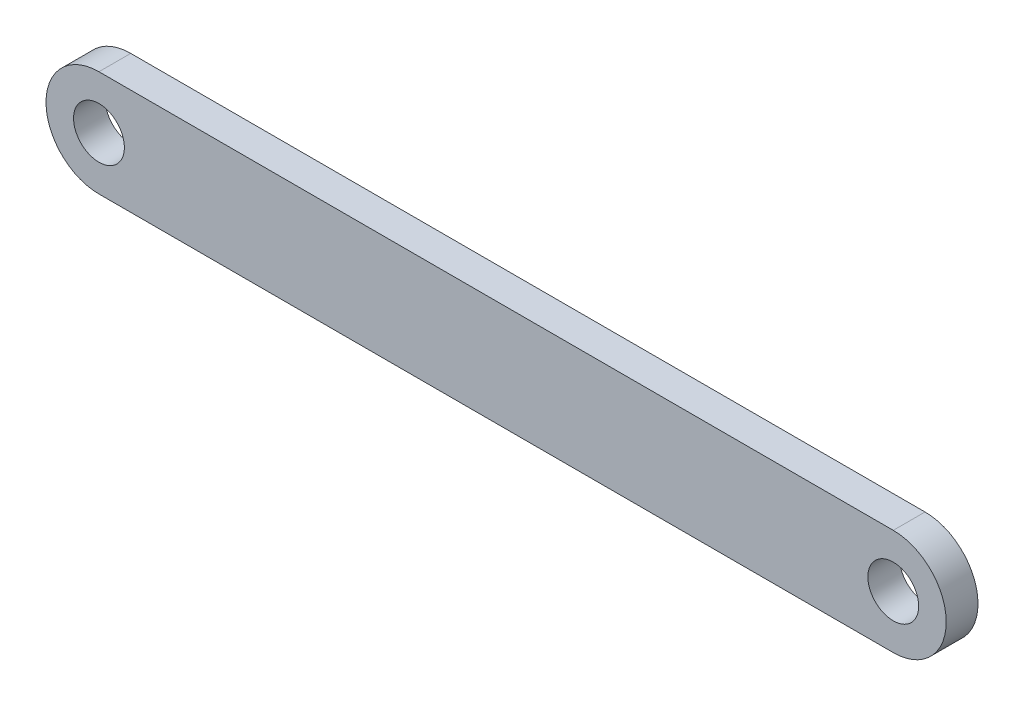
ISO-10303-21;
HEADER;
FILE_DESCRIPTION(('STEP AP214'),'2;1');
FILE_NAME('part.step','',(''),(''),'','','');
FILE_SCHEMA(('AUTOMOTIVE_DESIGN { 1 0 10303 214 1 1 1 1 }'));
ENDSEC;
DATA;
#1=APPLICATION_CONTEXT('core data for automotive mechanical design processes');
#2=APPLICATION_PROTOCOL_DEFINITION('international standard','automotive_design',2000,#1);
#3=PRODUCT_CONTEXT('',#1,'mechanical');
#4=PRODUCT('Part','Part','',(#3));
#5=PRODUCT_RELATED_PRODUCT_CATEGORY('part','',(#4));
#6=PRODUCT_DEFINITION_FORMATION('','',#4);
#7=PRODUCT_DEFINITION_CONTEXT('part definition',#1,'design');
#8=PRODUCT_DEFINITION('design','',#6,#7);
#9=PRODUCT_DEFINITION_SHAPE('','',#8);
#10=(LENGTH_UNIT() NAMED_UNIT(*) SI_UNIT(.MILLI.,.METRE.));
#11=(NAMED_UNIT(*) PLANE_ANGLE_UNIT() SI_UNIT($,.RADIAN.));
#12=(NAMED_UNIT(*) SI_UNIT($,.STERADIAN.) SOLID_ANGLE_UNIT());
#13=UNCERTAINTY_MEASURE_WITH_UNIT(LENGTH_MEASURE(1.E-05),#10,'distance_accuracy_value','');
#14=(GEOMETRIC_REPRESENTATION_CONTEXT(3) GLOBAL_UNCERTAINTY_ASSIGNED_CONTEXT((#13)) GLOBAL_UNIT_ASSIGNED_CONTEXT((#10,
#11,#12)) REPRESENTATION_CONTEXT('',''));
#15=CARTESIAN_POINT('',(0.,0.,0.));
#16=DIRECTION('',(0.,0.,1.));
#17=DIRECTION('',(1.,0.,0.));
#18=AXIS2_PLACEMENT_3D('',#15,#16,#17);
#19=CARTESIAN_POINT('',(120.078651701107,195.032322866027,3.));
#20=DIRECTION('',(0.,0.,1.));
#21=DIRECTION('',(1.,0.,0.));
#22=AXIS2_PLACEMENT_3D('',#19,#20,#21);
#23=PLANE('',#22);
#24=CARTESIAN_POINT('',(120.078651701107,195.032322866027,3.));
#25=DIRECTION('',(0.,0.,1.));
#26=DIRECTION('',(1.,0.,0.));
#27=AXIS2_PLACEMENT_3D('',#24,#25,#26);
#28=CIRCLE('',#27,2.4);
#29=CARTESIAN_POINT('',(122.478651701107,195.032322866027,3.));
#30=VERTEX_POINT('',#29);
#31=EDGE_CURVE('E106',#30,#30,#28,.T.);
#32=ORIENTED_EDGE('',*,*,#31,.F.);
#33=EDGE_LOOP('',(#32));
#34=FACE_BOUND('',#33,.T.);
#35=CARTESIAN_POINT('',(120.078651701107,195.032322866027,3.));
#36=DIRECTION('',(0.,0.,1.));
#37=DIRECTION('',(1.,0.,0.));
#38=AXIS2_PLACEMENT_3D('',#35,#36,#37);
#39=CIRCLE('',#38,4.99999999999999);
#40=CARTESIAN_POINT('',(120.078651701107,200.032322866027,3.));
#41=VERTEX_POINT('',#40);
#42=CARTESIAN_POINT('',(120.078651701107,190.032322866027,3.));
#43=VERTEX_POINT('',#42);
#44=EDGE_CURVE('E91',#41,#43,#39,.T.);
#45=ORIENTED_EDGE('',*,*,#44,.T.);
#46=DIRECTION('',(1.,0.,0.));
#47=VECTOR('',#46,1.);
#48=CARTESIAN_POINT('',(120.078651701107,190.032322866027,3.));
#49=LINE('',#48,#47);
#50=CARTESIAN_POINT('',(195.078651701107,190.032322866027,3.));
#51=VERTEX_POINT('',#50);
#52=EDGE_CURVE('E86',#43,#51,#49,.T.);
#53=ORIENTED_EDGE('',*,*,#52,.T.);
#54=CARTESIAN_POINT('',(195.078651701107,195.032322866027,3.));
#55=DIRECTION('',(0.,0.,1.));
#56=DIRECTION('',(-1.,0.,0.));
#57=AXIS2_PLACEMENT_3D('',#54,#55,#56);
#58=CIRCLE('',#57,5.);
#59=CARTESIAN_POINT('',(195.078651701107,200.032322866027,3.));
#60=VERTEX_POINT('',#59);
#61=EDGE_CURVE('E89',#51,#60,#58,.T.);
#62=ORIENTED_EDGE('',*,*,#61,.T.);
#63=DIRECTION('',(-1.,0.,0.));
#64=VECTOR('',#63,1.);
#65=CARTESIAN_POINT('',(120.078651701107,200.032322866027,3.));
#66=LINE('',#65,#64);
#67=EDGE_CURVE('E56',#60,#41,#66,.T.);
#68=ORIENTED_EDGE('',*,*,#67,.T.);
#69=EDGE_LOOP('',(#45,#53,#62,#68));
#70=FACE_BOUND('',#69,.T.);
#71=CARTESIAN_POINT('',(195.078651701107,195.032322866027,3.));
#72=DIRECTION('',(0.,0.,1.));
#73=DIRECTION('',(1.,0.,0.));
#74=AXIS2_PLACEMENT_3D('',#71,#72,#73);
#75=CIRCLE('',#74,2.4);
#76=CARTESIAN_POINT('',(197.478651701107,195.032322866027,3.));
#77=VERTEX_POINT('',#76);
#78=EDGE_CURVE('E121',#77,#77,#75,.T.);
#79=ORIENTED_EDGE('',*,*,#78,.F.);
#80=EDGE_LOOP('',(#79));
#81=FACE_BOUND('',#80,.T.);
#82=ADVANCED_FACE('F39',(#34,#70,#81),#23,.T.);
#83=CARTESIAN_POINT('',(120.078651701107,195.032322866027,0.));
#84=DIRECTION('',(0.,0.,1.));
#85=DIRECTION('',(1.,0.,0.));
#86=AXIS2_PLACEMENT_3D('',#83,#84,#85);
#87=PLANE('',#86);
#88=CARTESIAN_POINT('',(120.078651701107,195.032322866027,0.));
#89=DIRECTION('',(0.,0.,1.));
#90=DIRECTION('',(1.,0.,0.));
#91=AXIS2_PLACEMENT_3D('',#88,#89,#90);
#92=CIRCLE('',#91,4.99999999999999);
#93=CARTESIAN_POINT('',(120.078651701107,200.032322866027,0.));
#94=VERTEX_POINT('',#93);
#95=CARTESIAN_POINT('',(120.078651701107,190.032322866027,0.));
#96=VERTEX_POINT('',#95);
#97=EDGE_CURVE('E103',#94,#96,#92,.T.);
#98=ORIENTED_EDGE('',*,*,#97,.F.);
#99=DIRECTION('',(-1.,0.,0.));
#100=VECTOR('',#99,1.);
#101=CARTESIAN_POINT('',(120.078651701107,200.032322866027,0.));
#102=LINE('',#101,#100);
#103=CARTESIAN_POINT('',(195.078651701107,200.032322866027,0.));
#104=VERTEX_POINT('',#103);
#105=EDGE_CURVE('E79',#104,#94,#102,.T.);
#106=ORIENTED_EDGE('',*,*,#105,.F.);
#107=CARTESIAN_POINT('',(195.078651701107,195.032322866027,0.));
#108=DIRECTION('',(0.,0.,1.));
#109=DIRECTION('',(-1.,0.,0.));
#110=AXIS2_PLACEMENT_3D('',#107,#108,#109);
#111=CIRCLE('',#110,5.);
#112=CARTESIAN_POINT('',(195.078651701107,190.032322866027,0.));
#113=VERTEX_POINT('',#112);
#114=EDGE_CURVE('E73',#113,#104,#111,.T.);
#115=ORIENTED_EDGE('',*,*,#114,.F.);
#116=DIRECTION('',(1.,0.,0.));
#117=VECTOR('',#116,1.);
#118=CARTESIAN_POINT('',(120.078651701107,190.032322866027,0.));
#119=LINE('',#118,#117);
#120=EDGE_CURVE('E95',#96,#113,#119,.T.);
#121=ORIENTED_EDGE('',*,*,#120,.F.);
#122=EDGE_LOOP('',(#98,#106,#115,#121));
#123=FACE_BOUND('',#122,.T.);
#124=CARTESIAN_POINT('',(120.078651701107,195.032322866027,0.));
#125=DIRECTION('',(0.,0.,1.));
#126=DIRECTION('',(1.,0.,0.));
#127=AXIS2_PLACEMENT_3D('',#124,#125,#126);
#128=CIRCLE('',#127,2.4);
#129=CARTESIAN_POINT('',(122.478651701107,195.032322866027,0.));
#130=VERTEX_POINT('',#129);
#131=EDGE_CURVE('E118',#130,#130,#128,.T.);
#132=ORIENTED_EDGE('',*,*,#131,.T.);
#133=EDGE_LOOP('',(#132));
#134=FACE_BOUND('',#133,.T.);
#135=CARTESIAN_POINT('',(195.078651701107,195.032322866027,0.));
#136=DIRECTION('',(0.,0.,1.));
#137=DIRECTION('',(1.,0.,0.));
#138=AXIS2_PLACEMENT_3D('',#135,#136,#137);
#139=CIRCLE('',#138,2.4);
#140=CARTESIAN_POINT('',(197.478651701107,195.032322866027,0.));
#141=VERTEX_POINT('',#140);
#142=EDGE_CURVE('E124',#141,#141,#139,.T.);
#143=ORIENTED_EDGE('',*,*,#142,.T.);
#144=EDGE_LOOP('',(#143));
#145=FACE_BOUND('',#144,.T.);
#146=ADVANCED_FACE('F114',(#123,#134,#145),#87,.F.);
#147=CARTESIAN_POINT('',(120.078651701107,195.032322866027,3.));
#148=DIRECTION('',(0.,0.,-1.));
#149=DIRECTION('',(-1.,0.,0.));
#150=AXIS2_PLACEMENT_3D('',#147,#148,#149);
#151=CYLINDRICAL_SURFACE('',#150,4.99999999999999);
#152=ORIENTED_EDGE('',*,*,#97,.T.);
#153=DIRECTION('',(0.,0.,-1.));
#154=VECTOR('',#153,1.);
#155=CARTESIAN_POINT('',(120.078651701107,190.032322866027,3.));
#156=LINE('',#155,#154);
#157=EDGE_CURVE('E11',#43,#96,#156,.T.);
#158=ORIENTED_EDGE('',*,*,#157,.F.);
#159=ORIENTED_EDGE('',*,*,#44,.F.);
#160=DIRECTION('',(0.,0.,-1.));
#161=VECTOR('',#160,1.);
#162=CARTESIAN_POINT('',(120.078651701107,200.032322866027,3.));
#163=LINE('',#162,#161);
#164=EDGE_CURVE('E99',#41,#94,#163,.T.);
#165=ORIENTED_EDGE('',*,*,#164,.T.);
#166=EDGE_LOOP('',(#152,#158,#159,#165));
#167=FACE_BOUND('',#166,.T.);
#168=ADVANCED_FACE('F41',(#167),#151,.T.);
#169=CARTESIAN_POINT('',(120.078651701107,190.032322866027,3.));
#170=DIRECTION('',(0.,1.,0.));
#171=DIRECTION('',(0.,0.,1.));
#172=AXIS2_PLACEMENT_3D('',#169,#170,#171);
#173=PLANE('',#172);
#174=ORIENTED_EDGE('',*,*,#120,.T.);
#175=DIRECTION('',(0.,0.,-1.));
#176=VECTOR('',#175,1.);
#177=CARTESIAN_POINT('',(195.078651701107,190.032322866027,3.));
#178=LINE('',#177,#176);
#179=EDGE_CURVE('E48',#51,#113,#178,.T.);
#180=ORIENTED_EDGE('',*,*,#179,.F.);
#181=ORIENTED_EDGE('',*,*,#52,.F.);
#182=ORIENTED_EDGE('',*,*,#157,.T.);
#183=EDGE_LOOP('',(#174,#180,#181,#182));
#184=FACE_BOUND('',#183,.T.);
#185=ADVANCED_FACE('F94',(#184),#173,.F.);
#186=CARTESIAN_POINT('',(195.078651701107,195.032322866027,3.));
#187=DIRECTION('',(0.,0.,-1.));
#188=DIRECTION('',(-1.,0.,0.));
#189=AXIS2_PLACEMENT_3D('',#186,#187,#188);
#190=CYLINDRICAL_SURFACE('',#189,5.);
#191=ORIENTED_EDGE('',*,*,#114,.T.);
#192=DIRECTION('',(0.,0.,-1.));
#193=VECTOR('',#192,1.);
#194=CARTESIAN_POINT('',(195.078651701107,200.032322866027,3.));
#195=LINE('',#194,#193);
#196=EDGE_CURVE('E96',#60,#104,#195,.T.);
#197=ORIENTED_EDGE('',*,*,#196,.F.);
#198=ORIENTED_EDGE('',*,*,#61,.F.);
#199=ORIENTED_EDGE('',*,*,#179,.T.);
#200=EDGE_LOOP('',(#191,#197,#198,#199));
#201=FACE_BOUND('',#200,.T.);
#202=ADVANCED_FACE('F97',(#201),#190,.T.);
#203=CARTESIAN_POINT('',(120.078651701107,200.032322866027,3.));
#204=DIRECTION('',(0.,-1.,0.));
#205=DIRECTION('',(1.,0.,0.));
#206=AXIS2_PLACEMENT_3D('',#203,#204,#205);
#207=PLANE('',#206);
#208=ORIENTED_EDGE('',*,*,#105,.T.);
#209=ORIENTED_EDGE('',*,*,#164,.F.);
#210=ORIENTED_EDGE('',*,*,#67,.F.);
#211=ORIENTED_EDGE('',*,*,#196,.T.);
#212=EDGE_LOOP('',(#208,#209,#210,#211));
#213=FACE_BOUND('',#212,.T.);
#214=ADVANCED_FACE('F111',(#213),#207,.F.);
#215=CARTESIAN_POINT('',(120.078651701107,195.032322866027,3.));
#216=DIRECTION('',(0.,0.,-1.));
#217=DIRECTION('',(-1.,0.,0.));
#218=AXIS2_PLACEMENT_3D('',#215,#216,#217);
#219=CYLINDRICAL_SURFACE('',#218,2.4);
#220=ORIENTED_EDGE('',*,*,#31,.T.);
#221=EDGE_LOOP('',(#220));
#222=FACE_BOUND('',#221,.T.);
#223=ORIENTED_EDGE('',*,*,#131,.F.);
#224=EDGE_LOOP('',(#223));
#225=FACE_BOUND('',#224,.T.);
#226=ADVANCED_FACE('F141',(#222,#225),#219,.F.);
#227=CARTESIAN_POINT('',(195.078651701107,195.032322866027,3.));
#228=DIRECTION('',(0.,0.,-1.));
#229=DIRECTION('',(-1.,0.,0.));
#230=AXIS2_PLACEMENT_3D('',#227,#228,#229);
#231=CYLINDRICAL_SURFACE('',#230,2.4);
#232=ORIENTED_EDGE('',*,*,#78,.T.);
#233=EDGE_LOOP('',(#232));
#234=FACE_BOUND('',#233,.T.);
#235=ORIENTED_EDGE('',*,*,#142,.F.);
#236=EDGE_LOOP('',(#235));
#237=FACE_BOUND('',#236,.T.);
#238=ADVANCED_FACE('F130',(#234,#237),#231,.F.);
#239=CLOSED_SHELL('',(#82,#146,#168,#185,#202,#214,#226,#238));
#240=MANIFOLD_SOLID_BREP('B2',#239);
#241=ADVANCED_BREP_SHAPE_REPRESENTATION('',(#18,#240),#14);
#242=SHAPE_DEFINITION_REPRESENTATION(#9,#241);
ENDSEC;
END-ISO-10303-21;
